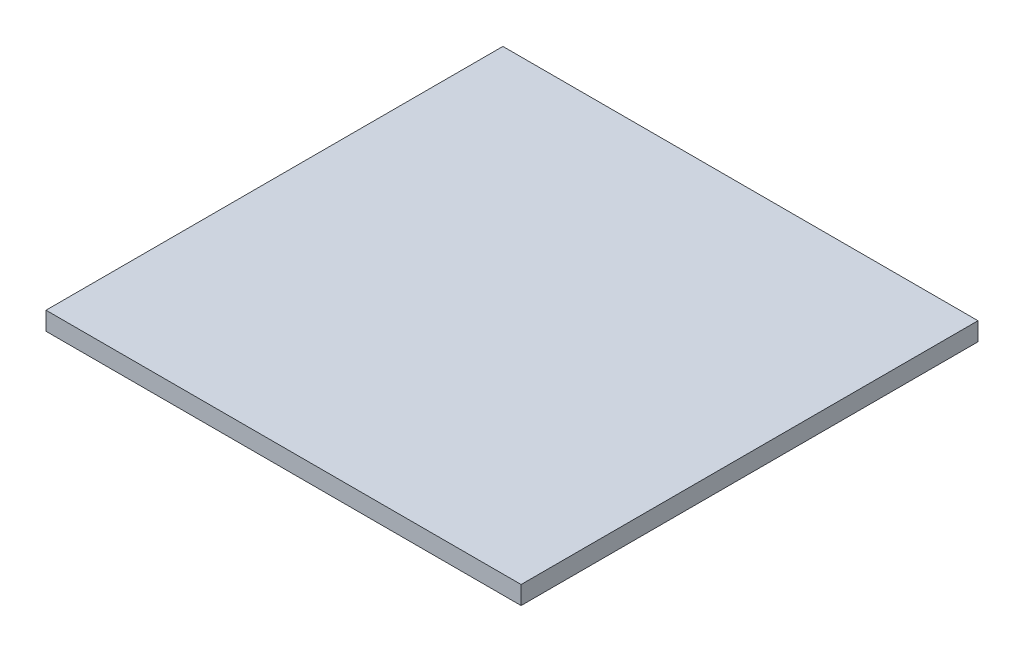
ISO-10303-21;
HEADER;
FILE_DESCRIPTION(('STEP AP214'),'2;1');
FILE_NAME('part.step','',(''),(''),'','','');
FILE_SCHEMA(('AUTOMOTIVE_DESIGN { 1 0 10303 214 1 1 1 1 }'));
ENDSEC;
DATA;
#1=APPLICATION_CONTEXT('core data for automotive mechanical design processes');
#2=APPLICATION_PROTOCOL_DEFINITION('international standard','automotive_design',2000,#1);
#3=PRODUCT_CONTEXT('',#1,'mechanical');
#4=PRODUCT('Part','Part','',(#3));
#5=PRODUCT_RELATED_PRODUCT_CATEGORY('part','',(#4));
#6=PRODUCT_DEFINITION_FORMATION('','',#4);
#7=PRODUCT_DEFINITION_CONTEXT('part definition',#1,'design');
#8=PRODUCT_DEFINITION('design','',#6,#7);
#9=PRODUCT_DEFINITION_SHAPE('','',#8);
#10=(LENGTH_UNIT() NAMED_UNIT(*) SI_UNIT(.MILLI.,.METRE.));
#11=(NAMED_UNIT(*) PLANE_ANGLE_UNIT() SI_UNIT($,.RADIAN.));
#12=(NAMED_UNIT(*) SI_UNIT($,.STERADIAN.) SOLID_ANGLE_UNIT());
#13=UNCERTAINTY_MEASURE_WITH_UNIT(LENGTH_MEASURE(1.E-05),#10,'distance_accuracy_value','');
#14=(GEOMETRIC_REPRESENTATION_CONTEXT(3) GLOBAL_UNCERTAINTY_ASSIGNED_CONTEXT((#13)) GLOBAL_UNIT_ASSIGNED_CONTEXT((#10,
#11,#12)) REPRESENTATION_CONTEXT('',''));
#15=CARTESIAN_POINT('',(0.,0.,0.));
#16=DIRECTION('',(0.,0.,1.));
#17=DIRECTION('',(1.,0.,0.));
#18=AXIS2_PLACEMENT_3D('',#15,#16,#17);
#19=CARTESIAN_POINT('',(0.,25.4,0.));
#20=DIRECTION('',(-1.,0.,0.));
#21=DIRECTION('',(0.,0.,1.));
#22=AXIS2_PLACEMENT_3D('',#19,#20,#21);
#23=PLANE('',#22);
#24=DIRECTION('',(0.,0.,-1.));
#25=VECTOR('',#24,1.);
#26=CARTESIAN_POINT('',(0.,0.,0.));
#27=LINE('',#26,#25);
#28=CARTESIAN_POINT('',(0.,0.,0.));
#29=VERTEX_POINT('',#28);
#30=CARTESIAN_POINT('',(0.,0.,-635.092087706127));
#31=VERTEX_POINT('',#30);
#32=EDGE_CURVE('E96',#29,#31,#27,.T.);
#33=ORIENTED_EDGE('',*,*,#32,.T.);
#34=DIRECTION('',(0.,-1.,0.));
#35=VECTOR('',#34,1.);
#36=CARTESIAN_POINT('',(0.,25.4,-635.092087706127));
#37=LINE('',#36,#35);
#38=CARTESIAN_POINT('',(0.,25.4,-635.092087706127));
#39=VERTEX_POINT('',#38);
#40=EDGE_CURVE('E11',#39,#31,#37,.T.);
#41=ORIENTED_EDGE('',*,*,#40,.F.);
#42=DIRECTION('',(0.,0.,-1.));
#43=VECTOR('',#42,1.);
#44=CARTESIAN_POINT('',(0.,25.4,0.));
#45=LINE('',#44,#43);
#46=CARTESIAN_POINT('',(0.,25.4,0.));
#47=VERTEX_POINT('',#46);
#48=EDGE_CURVE('E84',#47,#39,#45,.T.);
#49=ORIENTED_EDGE('',*,*,#48,.F.);
#50=DIRECTION('',(0.,-1.,0.));
#51=VECTOR('',#50,1.);
#52=CARTESIAN_POINT('',(0.,25.4,0.));
#53=LINE('',#52,#51);
#54=EDGE_CURVE('E92',#47,#29,#53,.T.);
#55=ORIENTED_EDGE('',*,*,#54,.T.);
#56=EDGE_LOOP('',(#33,#41,#49,#55));
#57=FACE_BOUND('',#56,.T.);
#58=ADVANCED_FACE('F33',(#57),#23,.F.);
#59=CARTESIAN_POINT('',(0.,25.4,-635.092087706127));
#60=DIRECTION('',(0.,0.,1.));
#61=DIRECTION('',(1.,0.,0.));
#62=AXIS2_PLACEMENT_3D('',#59,#60,#61);
#63=PLANE('',#62);
#64=DIRECTION('',(-1.,0.,0.));
#65=VECTOR('',#64,1.);
#66=CARTESIAN_POINT('',(0.,0.,-635.092087706127));
#67=LINE('',#66,#65);
#68=CARTESIAN_POINT('',(-660.4,0.,-635.092087706127));
#69=VERTEX_POINT('',#68);
#70=EDGE_CURVE('E88',#31,#69,#67,.T.);
#71=ORIENTED_EDGE('',*,*,#70,.T.);
#72=DIRECTION('',(0.,-1.,0.));
#73=VECTOR('',#72,1.);
#74=CARTESIAN_POINT('',(-660.4,25.4,-635.092087706127));
#75=LINE('',#74,#73);
#76=CARTESIAN_POINT('',(-660.4,25.4,-635.092087706127));
#77=VERTEX_POINT('',#76);
#78=EDGE_CURVE('E41',#77,#69,#75,.T.);
#79=ORIENTED_EDGE('',*,*,#78,.F.);
#80=DIRECTION('',(-1.,0.,0.));
#81=VECTOR('',#80,1.);
#82=CARTESIAN_POINT('',(0.,25.4,-635.092087706127));
#83=LINE('',#82,#81);
#84=EDGE_CURVE('E79',#39,#77,#83,.T.);
#85=ORIENTED_EDGE('',*,*,#84,.F.);
#86=ORIENTED_EDGE('',*,*,#40,.T.);
#87=EDGE_LOOP('',(#71,#79,#85,#86));
#88=FACE_BOUND('',#87,.T.);
#89=ADVANCED_FACE('F87',(#88),#63,.F.);
#90=CARTESIAN_POINT('',(-660.4,25.4,0.));
#91=DIRECTION('',(1.,0.,0.));
#92=DIRECTION('',(0.,0.,-1.));
#93=AXIS2_PLACEMENT_3D('',#90,#91,#92);
#94=PLANE('',#93);
#95=DIRECTION('',(0.,0.,1.));
#96=VECTOR('',#95,1.);
#97=CARTESIAN_POINT('',(-660.4,0.,0.));
#98=LINE('',#97,#96);
#99=CARTESIAN_POINT('',(-660.4,0.,0.));
#100=VERTEX_POINT('',#99);
#101=EDGE_CURVE('E66',#69,#100,#98,.T.);
#102=ORIENTED_EDGE('',*,*,#101,.T.);
#103=DIRECTION('',(0.,-1.,0.));
#104=VECTOR('',#103,1.);
#105=CARTESIAN_POINT('',(-660.4,25.4,0.));
#106=LINE('',#105,#104);
#107=CARTESIAN_POINT('',(-660.4,25.4,0.));
#108=VERTEX_POINT('',#107);
#109=EDGE_CURVE('E89',#108,#100,#106,.T.);
#110=ORIENTED_EDGE('',*,*,#109,.F.);
#111=DIRECTION('',(0.,0.,1.));
#112=VECTOR('',#111,1.);
#113=CARTESIAN_POINT('',(-660.4,25.4,0.));
#114=LINE('',#113,#112);
#115=EDGE_CURVE('E82',#77,#108,#114,.T.);
#116=ORIENTED_EDGE('',*,*,#115,.F.);
#117=ORIENTED_EDGE('',*,*,#78,.T.);
#118=EDGE_LOOP('',(#102,#110,#116,#117));
#119=FACE_BOUND('',#118,.T.);
#120=ADVANCED_FACE('F90',(#119),#94,.F.);
#121=CARTESIAN_POINT('',(0.,25.4,0.));
#122=DIRECTION('',(0.,0.,-1.));
#123=DIRECTION('',(-1.,0.,0.));
#124=AXIS2_PLACEMENT_3D('',#121,#122,#123);
#125=PLANE('',#124);
#126=DIRECTION('',(1.,0.,0.));
#127=VECTOR('',#126,1.);
#128=CARTESIAN_POINT('',(0.,0.,0.));
#129=LINE('',#128,#127);
#130=EDGE_CURVE('E72',#100,#29,#129,.T.);
#131=ORIENTED_EDGE('',*,*,#130,.T.);
#132=ORIENTED_EDGE('',*,*,#54,.F.);
#133=DIRECTION('',(1.,0.,0.));
#134=VECTOR('',#133,1.);
#135=CARTESIAN_POINT('',(0.,25.4,0.));
#136=LINE('',#135,#134);
#137=EDGE_CURVE('E49',#108,#47,#136,.T.);
#138=ORIENTED_EDGE('',*,*,#137,.F.);
#139=ORIENTED_EDGE('',*,*,#109,.T.);
#140=EDGE_LOOP('',(#131,#132,#138,#139));
#141=FACE_BOUND('',#140,.T.);
#142=ADVANCED_FACE('F103',(#141),#125,.F.);
#143=CARTESIAN_POINT('',(0.,25.4,0.));
#144=DIRECTION('',(0.,1.,0.));
#145=DIRECTION('',(0.,0.,1.));
#146=AXIS2_PLACEMENT_3D('',#143,#144,#145);
#147=PLANE('',#146);
#148=ORIENTED_EDGE('',*,*,#48,.T.);
#149=ORIENTED_EDGE('',*,*,#84,.T.);
#150=ORIENTED_EDGE('',*,*,#115,.T.);
#151=ORIENTED_EDGE('',*,*,#137,.T.);
#152=EDGE_LOOP('',(#148,#149,#150,#151));
#153=FACE_BOUND('',#152,.T.);
#154=ADVANCED_FACE('F80',(#153),#147,.T.);
#155=CARTESIAN_POINT('',(0.,0.,0.));
#156=DIRECTION('',(0.,1.,0.));
#157=DIRECTION('',(0.,0.,1.));
#158=AXIS2_PLACEMENT_3D('',#155,#156,#157);
#159=PLANE('',#158);
#160=ORIENTED_EDGE('',*,*,#32,.F.);
#161=ORIENTED_EDGE('',*,*,#130,.F.);
#162=ORIENTED_EDGE('',*,*,#101,.F.);
#163=ORIENTED_EDGE('',*,*,#70,.F.);
#164=EDGE_LOOP('',(#160,#161,#162,#163));
#165=FACE_BOUND('',#164,.T.);
#166=ADVANCED_FACE('F106',(#165),#159,.F.);
#167=CLOSED_SHELL('',(#58,#89,#120,#142,#154,#166));
#168=MANIFOLD_SOLID_BREP('B2',#167);
#169=ADVANCED_BREP_SHAPE_REPRESENTATION('',(#18,#168),#14);
#170=SHAPE_DEFINITION_REPRESENTATION(#9,#169);
ENDSEC;
END-ISO-10303-21;
